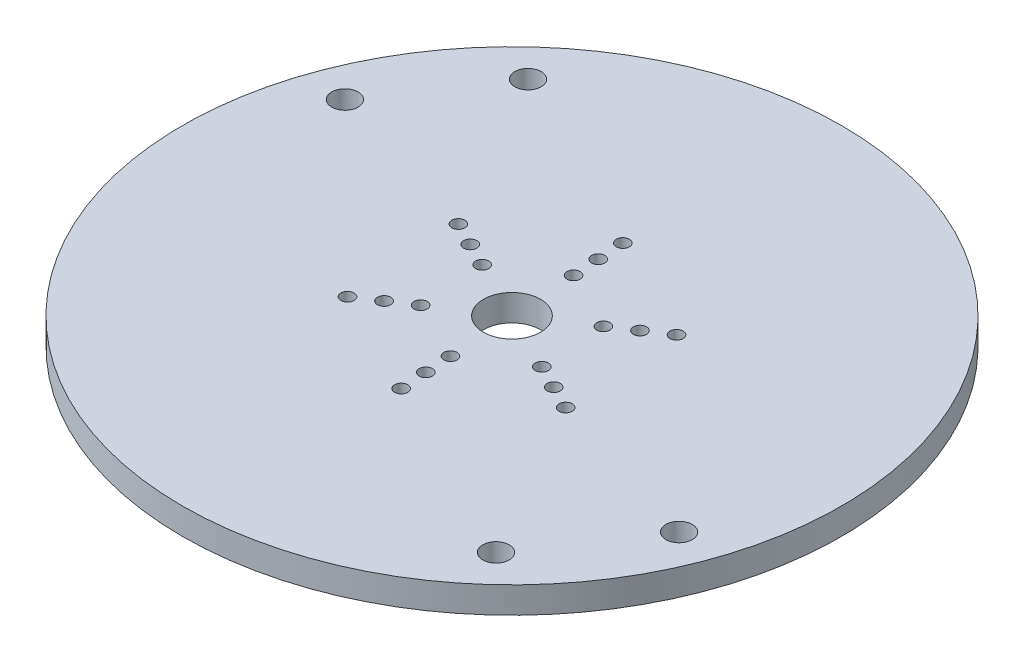
ISO-10303-21;
HEADER;
FILE_DESCRIPTION(('STEP AP214'),'2;1');
FILE_NAME('part.step','',(''),(''),'','','');
FILE_SCHEMA(('AUTOMOTIVE_DESIGN { 1 0 10303 214 1 1 1 1 }'));
ENDSEC;
DATA;
#1=APPLICATION_CONTEXT('core data for automotive mechanical design processes');
#2=APPLICATION_PROTOCOL_DEFINITION('international standard','automotive_design',2000,#1);
#3=PRODUCT_CONTEXT('',#1,'mechanical');
#4=PRODUCT('Part','Part','',(#3));
#5=PRODUCT_RELATED_PRODUCT_CATEGORY('part','',(#4));
#6=PRODUCT_DEFINITION_FORMATION('','',#4);
#7=PRODUCT_DEFINITION_CONTEXT('part definition',#1,'design');
#8=PRODUCT_DEFINITION('design','',#6,#7);
#9=PRODUCT_DEFINITION_SHAPE('','',#8);
#10=(LENGTH_UNIT() NAMED_UNIT(*) SI_UNIT(.MILLI.,.METRE.));
#11=(NAMED_UNIT(*) PLANE_ANGLE_UNIT() SI_UNIT($,.RADIAN.));
#12=(NAMED_UNIT(*) SI_UNIT($,.STERADIAN.) SOLID_ANGLE_UNIT());
#13=UNCERTAINTY_MEASURE_WITH_UNIT(LENGTH_MEASURE(1.E-05),#10,'distance_accuracy_value','');
#14=(GEOMETRIC_REPRESENTATION_CONTEXT(3) GLOBAL_UNCERTAINTY_ASSIGNED_CONTEXT((#13)) GLOBAL_UNIT_ASSIGNED_CONTEXT((#10,
#11,#12)) REPRESENTATION_CONTEXT('',''));
#15=CARTESIAN_POINT('',(0.,0.,0.));
#16=DIRECTION('',(0.,0.,1.));
#17=DIRECTION('',(1.,0.,0.));
#18=AXIS2_PLACEMENT_3D('',#15,#16,#17);
#19=CARTESIAN_POINT('',(0.,3.,0.));
#20=DIRECTION('',(0.,1.,0.));
#21=DIRECTION('',(0.,0.,1.));
#22=AXIS2_PLACEMENT_3D('',#19,#20,#21);
#23=PLANE('',#22);
#24=CARTESIAN_POINT('',(30.8159272313347,3.,11.8058726434488));
#25=DIRECTION('',(0.,1.,0.));
#26=DIRECTION('',(0.,0.,1.));
#27=AXIS2_PLACEMENT_3D('',#24,#25,#26);
#28=CIRCLE('',#27,1.5);
#29=CARTESIAN_POINT('',(30.8159272313347,3.,13.3058726434488));
#30=VERTEX_POINT('',#29);
#31=EDGE_CURVE('E173',#30,#30,#28,.T.);
#32=ORIENTED_EDGE('',*,*,#31,.F.);
#33=EDGE_LOOP('',(#32));
#34=FACE_BOUND('',#33,.T.);
#35=CARTESIAN_POINT('',(-22.4065879809971,3.,-24.2269439890752));
#36=DIRECTION('',(0.,1.,0.));
#37=DIRECTION('',(0.,0.,1.));
#38=AXIS2_PLACEMENT_3D('',#35,#36,#37);
#39=CIRCLE('',#38,1.5);
#40=CARTESIAN_POINT('',(-22.4065879809971,3.,-22.7269439890752));
#41=VERTEX_POINT('',#40);
#42=EDGE_CURVE('E161',#41,#41,#39,.T.);
#43=ORIENTED_EDGE('',*,*,#42,.F.);
#44=EDGE_LOOP('',(#43));
#45=FACE_BOUND('',#44,.T.);
#46=CARTESIAN_POINT('',(0.863160320935388,3.,13.4723774539));
#47=DIRECTION('',(0.,1.,0.));
#48=DIRECTION('',(0.,0.,1.));
#49=AXIS2_PLACEMENT_3D('',#46,#47,#48);
#50=CIRCLE('',#49,0.750000000000854);
#51=CARTESIAN_POINT('',(0.863160320935388,3.,14.2223774539008));
#52=VERTEX_POINT('',#51);
#53=EDGE_CURVE('E149',#52,#52,#50,.T.);
#54=ORIENTED_EDGE('',*,*,#53,.F.);
#55=EDGE_LOOP('',(#54));
#56=FACE_BOUND('',#55,.T.);
#57=CARTESIAN_POINT('',(0.479533511631039,3.,7.48465414105537));
#58=DIRECTION('',(0.,1.,0.));
#59=DIRECTION('',(0.,0.,1.));
#60=AXIS2_PLACEMENT_3D('',#57,#58,#59);
#61=CIRCLE('',#60,0.750000000000796);
#62=CARTESIAN_POINT('',(0.479533511631039,3.,8.23465414105617));
#63=VERTEX_POINT('',#62);
#64=EDGE_CURVE('E137',#63,#63,#61,.T.);
#65=ORIENTED_EDGE('',*,*,#64,.F.);
#66=EDGE_LOOP('',(#65));
#67=FACE_BOUND('',#66,.T.);
#68=CARTESIAN_POINT('',(-8.73898741643086,3.,5.82066138299208));
#69=DIRECTION('',(0.,1.,0.));
#70=DIRECTION('',(0.,0.,1.));
#71=AXIS2_PLACEMENT_3D('',#68,#69,#70);
#72=CIRCLE('',#71,0.750000000000445);
#73=CARTESIAN_POINT('',(-8.73898741643086,3.,6.57066138299253));
#74=VERTEX_POINT('',#73);
#75=EDGE_CURVE('E125',#74,#74,#72,.T.);
#76=ORIENTED_EDGE('',*,*,#75,.F.);
#77=EDGE_LOOP('',(#76));
#78=FACE_BOUND('',#77,.T.);
#79=CARTESIAN_POINT('',(12.0990012849182,3.,5.98866996148121));
#80=DIRECTION('',(0.,1.,0.));
#81=DIRECTION('',(0.,0.,1.));
#82=AXIS2_PLACEMENT_3D('',#79,#80,#81);
#83=CIRCLE('',#82,0.750000000000913);
#84=CARTESIAN_POINT('',(12.0990012849182,3.,6.73866996148212));
#85=VERTEX_POINT('',#84);
#86=EDGE_CURVE('E113',#85,#85,#83,.T.);
#87=ORIENTED_EDGE('',*,*,#86,.F.);
#88=EDGE_LOOP('',(#87));
#89=FACE_BOUND('',#88,.T.);
#90=CARTESIAN_POINT('',(6.72166738051029,3.,3.32703886748922));
#91=DIRECTION('',(0.,1.,0.));
#92=DIRECTION('',(0.,0.,1.));
#93=AXIS2_PLACEMENT_3D('',#90,#91,#92);
#94=CIRCLE('',#93,0.750000000000871);
#95=CARTESIAN_POINT('',(6.72166738051029,3.,4.07703886749009));
#96=VERTEX_POINT('',#95);
#97=EDGE_CURVE('E101',#96,#96,#94,.T.);
#98=ORIENTED_EDGE('',*,*,#97,.F.);
#99=EDGE_LOOP('',(#98));
#100=FACE_BOUND('',#99,.T.);
#101=CARTESIAN_POINT('',(-9.41033433271387,3.,-4.65785441448598));
#102=DIRECTION('',(0.,1.,0.));
#103=DIRECTION('',(0.,0.,1.));
#104=AXIS2_PLACEMENT_3D('',#101,#102,#103);
#105=CIRCLE('',#104,0.750000000000015);
#106=CARTESIAN_POINT('',(-9.41033433271387,3.,-3.90785441448597));
#107=VERTEX_POINT('',#106);
#108=EDGE_CURVE('E89',#107,#107,#105,.T.);
#109=ORIENTED_EDGE('',*,*,#108,.F.);
#110=EDGE_LOOP('',(#109));
#111=FACE_BOUND('',#110,.T.);
#112=CARTESIAN_POINT('',(11.235840963983,3.,-7.48370749241916));
#113=DIRECTION('',(0.,1.,0.));
#114=DIRECTION('',(0.,0.,1.));
#115=AXIS2_PLACEMENT_3D('',#112,#113,#114);
#116=CIRCLE('',#115,0.750000000000572);
#117=CARTESIAN_POINT('',(11.235840963983,3.,-6.73370749241859));
#118=VERTEX_POINT('',#117);
#119=EDGE_CURVE('E77',#118,#118,#116,.T.);
#120=ORIENTED_EDGE('',*,*,#119,.F.);
#121=EDGE_LOOP('',(#120));
#122=FACE_BOUND('',#121,.T.);
#123=CARTESIAN_POINT('',(6.24213386887944,3.,-4.15761527356653));
#124=DIRECTION('',(0.,1.,0.));
#125=DIRECTION('',(0.,0.,1.));
#126=AXIS2_PLACEMENT_3D('',#123,#124,#125);
#127=CIRCLE('',#126,0.750000000000541);
#128=CARTESIAN_POINT('',(6.24213386887944,3.,-3.40761527356599));
#129=VERTEX_POINT('',#128);
#130=EDGE_CURVE('E65',#129,#129,#127,.T.);
#131=ORIENTED_EDGE('',*,*,#130,.F.);
#132=EDGE_LOOP('',(#131));
#133=FACE_BOUND('',#132,.T.);
#134=CARTESIAN_POINT('',(-0.67134691628258,3.,-10.4785157974781));
#135=DIRECTION('',(0.,1.,0.));
#136=DIRECTION('',(0.,0.,1.));
#137=AXIS2_PLACEMENT_3D('',#134,#135,#136);
#138=CIRCLE('',#137,0.750000000000001);
#139=CARTESIAN_POINT('',(-0.67134691628258,3.,-9.7285157974781));
#140=VERTEX_POINT('',#139);
#141=EDGE_CURVE('E53',#140,#140,#138,.T.);
#142=ORIENTED_EDGE('',*,*,#141,.F.);
#143=EDGE_LOOP('',(#142));
#144=FACE_BOUND('',#143,.T.);
#145=CARTESIAN_POINT('',(0.,3.,0.));
#146=DIRECTION('',(0.,1.,0.));
#147=DIRECTION('',(0.,0.,1.));
#148=AXIS2_PLACEMENT_3D('',#145,#146,#147);
#149=CIRCLE('',#148,37.5);
#150=CARTESIAN_POINT('',(0.,3.,37.5));
#151=VERTEX_POINT('',#150);
#152=EDGE_CURVE('E10',#151,#151,#149,.T.);
#153=ORIENTED_EDGE('',*,*,#152,.T.);
#154=EDGE_LOOP('',(#153));
#155=FACE_BOUND('',#154,.T.);
#156=CARTESIAN_POINT('',(-0.863160320934746,3.,-13.4723774539004));
#157=DIRECTION('',(0.,1.,0.));
#158=DIRECTION('',(0.,0.,1.));
#159=AXIS2_PLACEMENT_3D('',#156,#157,#158);
#160=CIRCLE('',#159,0.75);
#161=CARTESIAN_POINT('',(-0.863160320934746,3.,-12.7223774539004));
#162=VERTEX_POINT('',#161);
#163=EDGE_CURVE('E48',#162,#162,#160,.T.);
#164=ORIENTED_EDGE('',*,*,#163,.F.);
#165=EDGE_LOOP('',(#164));
#166=FACE_BOUND('',#165,.T.);
#167=CARTESIAN_POINT('',(-0.479533511630414,3.,-7.48465414105579));
#168=DIRECTION('',(0.,1.,0.));
#169=DIRECTION('',(0.,0.,1.));
#170=AXIS2_PLACEMENT_3D('',#167,#168,#169);
#171=CIRCLE('',#170,0.75);
#172=CARTESIAN_POINT('',(-0.479533511630414,3.,-6.73465414105579));
#173=VERTEX_POINT('',#172);
#174=EDGE_CURVE('E59',#173,#173,#171,.T.);
#175=ORIENTED_EDGE('',*,*,#174,.F.);
#176=EDGE_LOOP('',(#175));
#177=FACE_BOUND('',#176,.T.);
#178=CARTESIAN_POINT('',(8.73898741643124,3.,-5.82066138299285));
#179=DIRECTION('',(0.,1.,0.));
#180=DIRECTION('',(0.,0.,1.));
#181=AXIS2_PLACEMENT_3D('',#178,#179,#180);
#182=CIRCLE('',#181,0.750000000000557);
#183=CARTESIAN_POINT('',(8.73898741643124,3.,-5.07066138299229));
#184=VERTEX_POINT('',#183);
#185=EDGE_CURVE('E71',#184,#184,#182,.T.);
#186=ORIENTED_EDGE('',*,*,#185,.F.);
#187=EDGE_LOOP('',(#186));
#188=FACE_BOUND('',#187,.T.);
#189=CARTESIAN_POINT('',(-12.0990012849178,3.,-5.98866996148198));
#190=DIRECTION('',(0.,1.,0.));
#191=DIRECTION('',(0.,0.,1.));
#192=AXIS2_PLACEMENT_3D('',#189,#190,#191);
#193=CIRCLE('',#192,0.75);
#194=CARTESIAN_POINT('',(-12.0990012849178,3.,-5.23866996148198));
#195=VERTEX_POINT('',#194);
#196=EDGE_CURVE('E83',#195,#195,#193,.T.);
#197=ORIENTED_EDGE('',*,*,#196,.F.);
#198=EDGE_LOOP('',(#197));
#199=FACE_BOUND('',#198,.T.);
#200=CARTESIAN_POINT('',(-6.72166738050991,3.,-3.32703886748999));
#201=DIRECTION('',(0.,1.,0.));
#202=DIRECTION('',(0.,0.,1.));
#203=AXIS2_PLACEMENT_3D('',#200,#201,#202);
#204=CIRCLE('',#203,0.75);
#205=CARTESIAN_POINT('',(-6.72166738050991,3.,-2.57703886748999));
#206=VERTEX_POINT('',#205);
#207=EDGE_CURVE('E95',#206,#206,#204,.T.);
#208=ORIENTED_EDGE('',*,*,#207,.F.);
#209=EDGE_LOOP('',(#208));
#210=FACE_BOUND('',#209,.T.);
#211=CARTESIAN_POINT('',(9.41033433271426,3.,4.65785441448521));
#212=DIRECTION('',(0.,1.,0.));
#213=DIRECTION('',(0.,0.,1.));
#214=AXIS2_PLACEMENT_3D('',#211,#212,#213);
#215=CIRCLE('',#214,0.750000000000891);
#216=CARTESIAN_POINT('',(9.41033433271426,3.,5.4078544144861));
#217=VERTEX_POINT('',#216);
#218=EDGE_CURVE('E107',#217,#217,#215,.T.);
#219=ORIENTED_EDGE('',*,*,#218,.F.);
#220=EDGE_LOOP('',(#219));
#221=FACE_BOUND('',#220,.T.);
#222=CARTESIAN_POINT('',(-11.2358409639826,3.,7.48370749241839));
#223=DIRECTION('',(0.,1.,0.));
#224=DIRECTION('',(0.,0.,1.));
#225=AXIS2_PLACEMENT_3D('',#222,#223,#224);
#226=CIRCLE('',#225,0.750000000000477);
#227=CARTESIAN_POINT('',(-11.2358409639826,3.,8.23370749241887));
#228=VERTEX_POINT('',#227);
#229=EDGE_CURVE('E119',#228,#228,#226,.T.);
#230=ORIENTED_EDGE('',*,*,#229,.F.);
#231=EDGE_LOOP('',(#230));
#232=FACE_BOUND('',#231,.T.);
#233=CARTESIAN_POINT('',(-6.24213386887954,3.,4.15761527356571));
#234=DIRECTION('',(0.,1.,0.));
#235=DIRECTION('',(0.,0.,1.));
#236=AXIS2_PLACEMENT_3D('',#233,#234,#235);
#237=CIRCLE('',#236,0.749999999999999);
#238=CARTESIAN_POINT('',(-6.24213386887954,3.,4.90761527356571));
#239=VERTEX_POINT('',#238);
#240=EDGE_CURVE('E131',#239,#239,#237,.T.);
#241=ORIENTED_EDGE('',*,*,#240,.F.);
#242=EDGE_LOOP('',(#241));
#243=FACE_BOUND('',#242,.T.);
#244=CARTESIAN_POINT('',(0.671346916283204,3.,10.4785157974777));
#245=DIRECTION('',(0.,1.,0.));
#246=DIRECTION('',(0.,0.,1.));
#247=AXIS2_PLACEMENT_3D('',#244,#245,#246);
#248=CIRCLE('',#247,0.750000000000822);
#249=CARTESIAN_POINT('',(0.671346916283204,3.,11.2285157974785));
#250=VERTEX_POINT('',#249);
#251=EDGE_CURVE('E143',#250,#250,#248,.T.);
#252=ORIENTED_EDGE('',*,*,#251,.F.);
#253=EDGE_LOOP('',(#252));
#254=FACE_BOUND('',#253,.T.);
#255=CARTESIAN_POINT('',(0.,3.,0.));
#256=DIRECTION('',(0.,1.,0.));
#257=DIRECTION('',(0.,0.,1.));
#258=AXIS2_PLACEMENT_3D('',#255,#256,#257);
#259=CIRCLE('',#258,3.25);
#260=CARTESIAN_POINT('',(0.,3.,3.25));
#261=VERTEX_POINT('',#260);
#262=EDGE_CURVE('E155',#261,#261,#259,.T.);
#263=ORIENTED_EDGE('',*,*,#262,.F.);
#264=EDGE_LOOP('',(#263));
#265=FACE_BOUND('',#264,.T.);
#266=CARTESIAN_POINT('',(-30.8159272313233,3.,-11.8058726434576));
#267=DIRECTION('',(0.,1.,0.));
#268=DIRECTION('',(0.,0.,1.));
#269=AXIS2_PLACEMENT_3D('',#266,#267,#268);
#270=CIRCLE('',#269,1.5);
#271=CARTESIAN_POINT('',(-30.8159272313233,3.,-10.3058726434576));
#272=VERTEX_POINT('',#271);
#273=EDGE_CURVE('E167',#272,#272,#270,.T.);
#274=ORIENTED_EDGE('',*,*,#273,.F.);
#275=EDGE_LOOP('',(#274));
#276=FACE_BOUND('',#275,.T.);
#277=CARTESIAN_POINT('',(22.4065879810086,3.,24.2269439890665));
#278=DIRECTION('',(0.,1.,0.));
#279=DIRECTION('',(0.,0.,1.));
#280=AXIS2_PLACEMENT_3D('',#277,#278,#279);
#281=CIRCLE('',#280,1.5);
#282=CARTESIAN_POINT('',(22.4065879810086,3.,25.7269439890665));
#283=VERTEX_POINT('',#282);
#284=EDGE_CURVE('E179',#283,#283,#281,.T.);
#285=ORIENTED_EDGE('',*,*,#284,.F.);
#286=EDGE_LOOP('',(#285));
#287=FACE_BOUND('',#286,.T.);
#288=ADVANCED_FACE('F37',(#34,#45,#56,#67,#78,#89,#100,#111,#122,#133,#144,#155,#166,#177,#188,
#199,#210,#221,#232,#243,#254,#265,#276,#287),#23,.T.);
#289=CARTESIAN_POINT('',(0.,0.,0.));
#290=DIRECTION('',(0.,1.,0.));
#291=DIRECTION('',(0.,0.,1.));
#292=AXIS2_PLACEMENT_3D('',#289,#290,#291);
#293=PLANE('',#292);
#294=CARTESIAN_POINT('',(0.,0.,0.));
#295=DIRECTION('',(0.,1.,0.));
#296=DIRECTION('',(0.,0.,1.));
#297=AXIS2_PLACEMENT_3D('',#294,#295,#296);
#298=CIRCLE('',#297,37.5);
#299=CARTESIAN_POINT('',(0.,0.,37.5));
#300=VERTEX_POINT('',#299);
#301=EDGE_CURVE('E41',#300,#300,#298,.T.);
#302=ORIENTED_EDGE('',*,*,#301,.F.);
#303=EDGE_LOOP('',(#302));
#304=FACE_BOUND('',#303,.T.);
#305=CARTESIAN_POINT('',(-0.863160320934746,0.,-13.4723774539004));
#306=DIRECTION('',(0.,1.,0.));
#307=DIRECTION('',(0.,0.,1.));
#308=AXIS2_PLACEMENT_3D('',#305,#306,#307);
#309=CIRCLE('',#308,0.75);
#310=CARTESIAN_POINT('',(-0.863160320934746,0.,-12.7223774539004));
#311=VERTEX_POINT('',#310);
#312=EDGE_CURVE('E50',#311,#311,#309,.T.);
#313=ORIENTED_EDGE('',*,*,#312,.T.);
#314=EDGE_LOOP('',(#313));
#315=FACE_BOUND('',#314,.T.);
#316=CARTESIAN_POINT('',(-0.67134691628258,0.,-10.4785157974781));
#317=DIRECTION('',(0.,1.,0.));
#318=DIRECTION('',(0.,0.,1.));
#319=AXIS2_PLACEMENT_3D('',#316,#317,#318);
#320=CIRCLE('',#319,0.750000000000001);
#321=CARTESIAN_POINT('',(-0.67134691628258,0.,-9.7285157974781));
#322=VERTEX_POINT('',#321);
#323=EDGE_CURVE('E56',#322,#322,#320,.T.);
#324=ORIENTED_EDGE('',*,*,#323,.T.);
#325=EDGE_LOOP('',(#324));
#326=FACE_BOUND('',#325,.T.);
#327=CARTESIAN_POINT('',(-0.479533511630414,0.,-7.48465414105579));
#328=DIRECTION('',(0.,1.,0.));
#329=DIRECTION('',(0.,0.,1.));
#330=AXIS2_PLACEMENT_3D('',#327,#328,#329);
#331=CIRCLE('',#330,0.75);
#332=CARTESIAN_POINT('',(-0.479533511630414,0.,-6.73465414105579));
#333=VERTEX_POINT('',#332);
#334=EDGE_CURVE('E62',#333,#333,#331,.T.);
#335=ORIENTED_EDGE('',*,*,#334,.T.);
#336=EDGE_LOOP('',(#335));
#337=FACE_BOUND('',#336,.T.);
#338=CARTESIAN_POINT('',(6.24213386887944,0.,-4.15761527356653));
#339=DIRECTION('',(0.,1.,0.));
#340=DIRECTION('',(0.,0.,1.));
#341=AXIS2_PLACEMENT_3D('',#338,#339,#340);
#342=CIRCLE('',#341,0.750000000000541);
#343=CARTESIAN_POINT('',(6.24213386887944,0.,-3.40761527356599));
#344=VERTEX_POINT('',#343);
#345=EDGE_CURVE('E68',#344,#344,#342,.T.);
#346=ORIENTED_EDGE('',*,*,#345,.T.);
#347=EDGE_LOOP('',(#346));
#348=FACE_BOUND('',#347,.T.);
#349=CARTESIAN_POINT('',(8.73898741643124,0.,-5.82066138299285));
#350=DIRECTION('',(0.,1.,0.));
#351=DIRECTION('',(0.,0.,1.));
#352=AXIS2_PLACEMENT_3D('',#349,#350,#351);
#353=CIRCLE('',#352,0.750000000000557);
#354=CARTESIAN_POINT('',(8.73898741643124,0.,-5.07066138299229));
#355=VERTEX_POINT('',#354);
#356=EDGE_CURVE('E74',#355,#355,#353,.T.);
#357=ORIENTED_EDGE('',*,*,#356,.T.);
#358=EDGE_LOOP('',(#357));
#359=FACE_BOUND('',#358,.T.);
#360=CARTESIAN_POINT('',(11.235840963983,0.,-7.48370749241916));
#361=DIRECTION('',(0.,1.,0.));
#362=DIRECTION('',(0.,0.,1.));
#363=AXIS2_PLACEMENT_3D('',#360,#361,#362);
#364=CIRCLE('',#363,0.750000000000572);
#365=CARTESIAN_POINT('',(11.235840963983,0.,-6.73370749241859));
#366=VERTEX_POINT('',#365);
#367=EDGE_CURVE('E80',#366,#366,#364,.T.);
#368=ORIENTED_EDGE('',*,*,#367,.T.);
#369=EDGE_LOOP('',(#368));
#370=FACE_BOUND('',#369,.T.);
#371=CARTESIAN_POINT('',(-12.0990012849178,0.,-5.98866996148198));
#372=DIRECTION('',(0.,1.,0.));
#373=DIRECTION('',(0.,0.,1.));
#374=AXIS2_PLACEMENT_3D('',#371,#372,#373);
#375=CIRCLE('',#374,0.75);
#376=CARTESIAN_POINT('',(-12.0990012849178,0.,-5.23866996148198));
#377=VERTEX_POINT('',#376);
#378=EDGE_CURVE('E86',#377,#377,#375,.T.);
#379=ORIENTED_EDGE('',*,*,#378,.T.);
#380=EDGE_LOOP('',(#379));
#381=FACE_BOUND('',#380,.T.);
#382=CARTESIAN_POINT('',(-9.41033433271387,0.,-4.65785441448598));
#383=DIRECTION('',(0.,1.,0.));
#384=DIRECTION('',(0.,0.,1.));
#385=AXIS2_PLACEMENT_3D('',#382,#383,#384);
#386=CIRCLE('',#385,0.750000000000015);
#387=CARTESIAN_POINT('',(-9.41033433271387,0.,-3.90785441448597));
#388=VERTEX_POINT('',#387);
#389=EDGE_CURVE('E92',#388,#388,#386,.T.);
#390=ORIENTED_EDGE('',*,*,#389,.T.);
#391=EDGE_LOOP('',(#390));
#392=FACE_BOUND('',#391,.T.);
#393=CARTESIAN_POINT('',(-6.72166738050991,0.,-3.32703886748999));
#394=DIRECTION('',(0.,1.,0.));
#395=DIRECTION('',(0.,0.,1.));
#396=AXIS2_PLACEMENT_3D('',#393,#394,#395);
#397=CIRCLE('',#396,0.75);
#398=CARTESIAN_POINT('',(-6.72166738050991,0.,-2.57703886748999));
#399=VERTEX_POINT('',#398);
#400=EDGE_CURVE('E98',#399,#399,#397,.T.);
#401=ORIENTED_EDGE('',*,*,#400,.T.);
#402=EDGE_LOOP('',(#401));
#403=FACE_BOUND('',#402,.T.);
#404=CARTESIAN_POINT('',(6.72166738051029,0.,3.32703886748922));
#405=DIRECTION('',(0.,1.,0.));
#406=DIRECTION('',(0.,0.,1.));
#407=AXIS2_PLACEMENT_3D('',#404,#405,#406);
#408=CIRCLE('',#407,0.750000000000871);
#409=CARTESIAN_POINT('',(6.72166738051029,0.,4.07703886749009));
#410=VERTEX_POINT('',#409);
#411=EDGE_CURVE('E104',#410,#410,#408,.T.);
#412=ORIENTED_EDGE('',*,*,#411,.T.);
#413=EDGE_LOOP('',(#412));
#414=FACE_BOUND('',#413,.T.);
#415=CARTESIAN_POINT('',(9.41033433271426,0.,4.65785441448521));
#416=DIRECTION('',(0.,1.,0.));
#417=DIRECTION('',(0.,0.,1.));
#418=AXIS2_PLACEMENT_3D('',#415,#416,#417);
#419=CIRCLE('',#418,0.750000000000891);
#420=CARTESIAN_POINT('',(9.41033433271426,0.,5.4078544144861));
#421=VERTEX_POINT('',#420);
#422=EDGE_CURVE('E110',#421,#421,#419,.T.);
#423=ORIENTED_EDGE('',*,*,#422,.T.);
#424=EDGE_LOOP('',(#423));
#425=FACE_BOUND('',#424,.T.);
#426=CARTESIAN_POINT('',(12.0990012849182,0.,5.98866996148121));
#427=DIRECTION('',(0.,1.,0.));
#428=DIRECTION('',(0.,0.,1.));
#429=AXIS2_PLACEMENT_3D('',#426,#427,#428);
#430=CIRCLE('',#429,0.750000000000913);
#431=CARTESIAN_POINT('',(12.0990012849182,0.,6.73866996148212));
#432=VERTEX_POINT('',#431);
#433=EDGE_CURVE('E116',#432,#432,#430,.T.);
#434=ORIENTED_EDGE('',*,*,#433,.T.);
#435=EDGE_LOOP('',(#434));
#436=FACE_BOUND('',#435,.T.);
#437=CARTESIAN_POINT('',(-11.2358409639826,0.,7.48370749241839));
#438=DIRECTION('',(0.,1.,0.));
#439=DIRECTION('',(0.,0.,1.));
#440=AXIS2_PLACEMENT_3D('',#437,#438,#439);
#441=CIRCLE('',#440,0.750000000000477);
#442=CARTESIAN_POINT('',(-11.2358409639826,0.,8.23370749241887));
#443=VERTEX_POINT('',#442);
#444=EDGE_CURVE('E122',#443,#443,#441,.T.);
#445=ORIENTED_EDGE('',*,*,#444,.T.);
#446=EDGE_LOOP('',(#445));
#447=FACE_BOUND('',#446,.T.);
#448=CARTESIAN_POINT('',(-8.73898741643086,0.,5.82066138299208));
#449=DIRECTION('',(0.,1.,0.));
#450=DIRECTION('',(0.,0.,1.));
#451=AXIS2_PLACEMENT_3D('',#448,#449,#450);
#452=CIRCLE('',#451,0.750000000000445);
#453=CARTESIAN_POINT('',(-8.73898741643086,0.,6.57066138299253));
#454=VERTEX_POINT('',#453);
#455=EDGE_CURVE('E128',#454,#454,#452,.T.);
#456=ORIENTED_EDGE('',*,*,#455,.T.);
#457=EDGE_LOOP('',(#456));
#458=FACE_BOUND('',#457,.T.);
#459=CARTESIAN_POINT('',(-6.24213386887954,0.,4.15761527356571));
#460=DIRECTION('',(0.,1.,0.));
#461=DIRECTION('',(0.,0.,1.));
#462=AXIS2_PLACEMENT_3D('',#459,#460,#461);
#463=CIRCLE('',#462,0.749999999999999);
#464=CARTESIAN_POINT('',(-6.24213386887954,0.,4.90761527356571));
#465=VERTEX_POINT('',#464);
#466=EDGE_CURVE('E134',#465,#465,#463,.T.);
#467=ORIENTED_EDGE('',*,*,#466,.T.);
#468=EDGE_LOOP('',(#467));
#469=FACE_BOUND('',#468,.T.);
#470=CARTESIAN_POINT('',(0.479533511631039,0.,7.48465414105537));
#471=DIRECTION('',(0.,1.,0.));
#472=DIRECTION('',(0.,0.,1.));
#473=AXIS2_PLACEMENT_3D('',#470,#471,#472);
#474=CIRCLE('',#473,0.750000000000796);
#475=CARTESIAN_POINT('',(0.479533511631039,0.,8.23465414105617));
#476=VERTEX_POINT('',#475);
#477=EDGE_CURVE('E140',#476,#476,#474,.T.);
#478=ORIENTED_EDGE('',*,*,#477,.T.);
#479=EDGE_LOOP('',(#478));
#480=FACE_BOUND('',#479,.T.);
#481=CARTESIAN_POINT('',(0.671346916283204,0.,10.4785157974777));
#482=DIRECTION('',(0.,1.,0.));
#483=DIRECTION('',(0.,0.,1.));
#484=AXIS2_PLACEMENT_3D('',#481,#482,#483);
#485=CIRCLE('',#484,0.750000000000822);
#486=CARTESIAN_POINT('',(0.671346916283204,0.,11.2285157974785));
#487=VERTEX_POINT('',#486);
#488=EDGE_CURVE('E146',#487,#487,#485,.T.);
#489=ORIENTED_EDGE('',*,*,#488,.T.);
#490=EDGE_LOOP('',(#489));
#491=FACE_BOUND('',#490,.T.);
#492=CARTESIAN_POINT('',(0.863160320935388,0.,13.4723774539));
#493=DIRECTION('',(0.,1.,0.));
#494=DIRECTION('',(0.,0.,1.));
#495=AXIS2_PLACEMENT_3D('',#492,#493,#494);
#496=CIRCLE('',#495,0.750000000000854);
#497=CARTESIAN_POINT('',(0.863160320935388,0.,14.2223774539008));
#498=VERTEX_POINT('',#497);
#499=EDGE_CURVE('E152',#498,#498,#496,.T.);
#500=ORIENTED_EDGE('',*,*,#499,.T.);
#501=EDGE_LOOP('',(#500));
#502=FACE_BOUND('',#501,.T.);
#503=CARTESIAN_POINT('',(0.,0.,0.));
#504=DIRECTION('',(0.,1.,0.));
#505=DIRECTION('',(0.,0.,1.));
#506=AXIS2_PLACEMENT_3D('',#503,#504,#505);
#507=CIRCLE('',#506,3.25);
#508=CARTESIAN_POINT('',(0.,0.,3.25));
#509=VERTEX_POINT('',#508);
#510=EDGE_CURVE('E158',#509,#509,#507,.T.);
#511=ORIENTED_EDGE('',*,*,#510,.T.);
#512=EDGE_LOOP('',(#511));
#513=FACE_BOUND('',#512,.T.);
#514=CARTESIAN_POINT('',(-22.4065879809971,0.,-24.2269439890752));
#515=DIRECTION('',(0.,1.,0.));
#516=DIRECTION('',(0.,0.,1.));
#517=AXIS2_PLACEMENT_3D('',#514,#515,#516);
#518=CIRCLE('',#517,1.5);
#519=CARTESIAN_POINT('',(-22.4065879809971,0.,-22.7269439890752));
#520=VERTEX_POINT('',#519);
#521=EDGE_CURVE('E164',#520,#520,#518,.T.);
#522=ORIENTED_EDGE('',*,*,#521,.T.);
#523=EDGE_LOOP('',(#522));
#524=FACE_BOUND('',#523,.T.);
#525=CARTESIAN_POINT('',(-30.8159272313233,0.,-11.8058726434576));
#526=DIRECTION('',(0.,1.,0.));
#527=DIRECTION('',(0.,0.,1.));
#528=AXIS2_PLACEMENT_3D('',#525,#526,#527);
#529=CIRCLE('',#528,1.5);
#530=CARTESIAN_POINT('',(-30.8159272313233,0.,-10.3058726434576));
#531=VERTEX_POINT('',#530);
#532=EDGE_CURVE('E170',#531,#531,#529,.T.);
#533=ORIENTED_EDGE('',*,*,#532,.T.);
#534=EDGE_LOOP('',(#533));
#535=FACE_BOUND('',#534,.T.);
#536=CARTESIAN_POINT('',(30.8159272313347,0.,11.8058726434488));
#537=DIRECTION('',(0.,1.,0.));
#538=DIRECTION('',(0.,0.,1.));
#539=AXIS2_PLACEMENT_3D('',#536,#537,#538);
#540=CIRCLE('',#539,1.5);
#541=CARTESIAN_POINT('',(30.8159272313347,0.,13.3058726434488));
#542=VERTEX_POINT('',#541);
#543=EDGE_CURVE('E176',#542,#542,#540,.T.);
#544=ORIENTED_EDGE('',*,*,#543,.T.);
#545=EDGE_LOOP('',(#544));
#546=FACE_BOUND('',#545,.T.);
#547=CARTESIAN_POINT('',(22.4065879810086,0.,24.2269439890665));
#548=DIRECTION('',(0.,1.,0.));
#549=DIRECTION('',(0.,0.,1.));
#550=AXIS2_PLACEMENT_3D('',#547,#548,#549);
#551=CIRCLE('',#550,1.5);
#552=CARTESIAN_POINT('',(22.4065879810086,0.,25.7269439890665));
#553=VERTEX_POINT('',#552);
#554=EDGE_CURVE('E182',#553,#553,#551,.T.);
#555=ORIENTED_EDGE('',*,*,#554,.T.);
#556=EDGE_LOOP('',(#555));
#557=FACE_BOUND('',#556,.T.);
#558=ADVANCED_FACE('F192',(#304,#315,#326,#337,#348,#359,#370,#381,#392,#403,#414,#425,#436,
#447,#458,#469,#480,#491,#502,#513,#524,#535,#546,#557),#293,.F.);
#559=CARTESIAN_POINT('',(0.,3.,0.));
#560=DIRECTION('',(0.,-1.,0.));
#561=DIRECTION('',(0.,0.,-1.));
#562=AXIS2_PLACEMENT_3D('',#559,#560,#561);
#563=CYLINDRICAL_SURFACE('',#562,37.5);
#564=ORIENTED_EDGE('',*,*,#152,.F.);
#565=EDGE_LOOP('',(#564));
#566=FACE_BOUND('',#565,.T.);
#567=ORIENTED_EDGE('',*,*,#301,.T.);
#568=EDGE_LOOP('',(#567));
#569=FACE_BOUND('',#568,.T.);
#570=ADVANCED_FACE('F39',(#566,#569),#563,.T.);
#571=CARTESIAN_POINT('',(-0.863160320934746,3.,-13.4723774539004));
#572=DIRECTION('',(0.,-1.,0.));
#573=DIRECTION('',(0.,0.,-1.));
#574=AXIS2_PLACEMENT_3D('',#571,#572,#573);
#575=CYLINDRICAL_SURFACE('',#574,0.75);
#576=ORIENTED_EDGE('',*,*,#163,.T.);
#577=EDGE_LOOP('',(#576));
#578=FACE_BOUND('',#577,.T.);
#579=ORIENTED_EDGE('',*,*,#312,.F.);
#580=EDGE_LOOP('',(#579));
#581=FACE_BOUND('',#580,.T.);
#582=ADVANCED_FACE('F202',(#578,#581),#575,.F.);
#583=CARTESIAN_POINT('',(-0.67134691628258,3.,-10.4785157974781));
#584=DIRECTION('',(0.,-1.,0.));
#585=DIRECTION('',(0.,0.,-1.));
#586=AXIS2_PLACEMENT_3D('',#583,#584,#585);
#587=CYLINDRICAL_SURFACE('',#586,0.750000000000001);
#588=ORIENTED_EDGE('',*,*,#141,.T.);
#589=EDGE_LOOP('',(#588));
#590=FACE_BOUND('',#589,.T.);
#591=ORIENTED_EDGE('',*,*,#323,.F.);
#592=EDGE_LOOP('',(#591));
#593=FACE_BOUND('',#592,.T.);
#594=ADVANCED_FACE('F205',(#590,#593),#587,.F.);
#595=CARTESIAN_POINT('',(-0.479533511630414,3.,-7.48465414105579));
#596=DIRECTION('',(0.,-1.,0.));
#597=DIRECTION('',(0.,0.,-1.));
#598=AXIS2_PLACEMENT_3D('',#595,#596,#597);
#599=CYLINDRICAL_SURFACE('',#598,0.75);
#600=ORIENTED_EDGE('',*,*,#174,.T.);
#601=EDGE_LOOP('',(#600));
#602=FACE_BOUND('',#601,.T.);
#603=ORIENTED_EDGE('',*,*,#334,.F.);
#604=EDGE_LOOP('',(#603));
#605=FACE_BOUND('',#604,.T.);
#606=ADVANCED_FACE('F209',(#602,#605),#599,.F.);
#607=CARTESIAN_POINT('',(6.24213386887944,3.,-4.15761527356653));
#608=DIRECTION('',(0.,-1.,0.));
#609=DIRECTION('',(0.,0.,-1.));
#610=AXIS2_PLACEMENT_3D('',#607,#608,#609);
#611=CYLINDRICAL_SURFACE('',#610,0.750000000000541);
#612=ORIENTED_EDGE('',*,*,#130,.T.);
#613=EDGE_LOOP('',(#612));
#614=FACE_BOUND('',#613,.T.);
#615=ORIENTED_EDGE('',*,*,#345,.F.);
#616=EDGE_LOOP('',(#615));
#617=FACE_BOUND('',#616,.T.);
#618=ADVANCED_FACE('F213',(#614,#617),#611,.F.);
#619=CARTESIAN_POINT('',(8.73898741643124,3.,-5.82066138299285));
#620=DIRECTION('',(0.,-1.,0.));
#621=DIRECTION('',(0.,0.,-1.));
#622=AXIS2_PLACEMENT_3D('',#619,#620,#621);
#623=CYLINDRICAL_SURFACE('',#622,0.750000000000557);
#624=ORIENTED_EDGE('',*,*,#185,.T.);
#625=EDGE_LOOP('',(#624));
#626=FACE_BOUND('',#625,.T.);
#627=ORIENTED_EDGE('',*,*,#356,.F.);
#628=EDGE_LOOP('',(#627));
#629=FACE_BOUND('',#628,.T.);
#630=ADVANCED_FACE('F217',(#626,#629),#623,.F.);
#631=CARTESIAN_POINT('',(11.235840963983,3.,-7.48370749241916));
#632=DIRECTION('',(0.,-1.,0.));
#633=DIRECTION('',(0.,0.,-1.));
#634=AXIS2_PLACEMENT_3D('',#631,#632,#633);
#635=CYLINDRICAL_SURFACE('',#634,0.750000000000572);
#636=ORIENTED_EDGE('',*,*,#119,.T.);
#637=EDGE_LOOP('',(#636));
#638=FACE_BOUND('',#637,.T.);
#639=ORIENTED_EDGE('',*,*,#367,.F.);
#640=EDGE_LOOP('',(#639));
#641=FACE_BOUND('',#640,.T.);
#642=ADVANCED_FACE('F221',(#638,#641),#635,.F.);
#643=CARTESIAN_POINT('',(-12.0990012849178,3.,-5.98866996148198));
#644=DIRECTION('',(0.,-1.,0.));
#645=DIRECTION('',(0.,0.,-1.));
#646=AXIS2_PLACEMENT_3D('',#643,#644,#645);
#647=CYLINDRICAL_SURFACE('',#646,0.75);
#648=ORIENTED_EDGE('',*,*,#196,.T.);
#649=EDGE_LOOP('',(#648));
#650=FACE_BOUND('',#649,.T.);
#651=ORIENTED_EDGE('',*,*,#378,.F.);
#652=EDGE_LOOP('',(#651));
#653=FACE_BOUND('',#652,.T.);
#654=ADVANCED_FACE('F225',(#650,#653),#647,.F.);
#655=CARTESIAN_POINT('',(-9.41033433271387,3.,-4.65785441448598));
#656=DIRECTION('',(0.,-1.,0.));
#657=DIRECTION('',(0.,0.,-1.));
#658=AXIS2_PLACEMENT_3D('',#655,#656,#657);
#659=CYLINDRICAL_SURFACE('',#658,0.750000000000015);
#660=ORIENTED_EDGE('',*,*,#108,.T.);
#661=EDGE_LOOP('',(#660));
#662=FACE_BOUND('',#661,.T.);
#663=ORIENTED_EDGE('',*,*,#389,.F.);
#664=EDGE_LOOP('',(#663));
#665=FACE_BOUND('',#664,.T.);
#666=ADVANCED_FACE('F229',(#662,#665),#659,.F.);
#667=CARTESIAN_POINT('',(-6.72166738050991,3.,-3.32703886748999));
#668=DIRECTION('',(0.,-1.,0.));
#669=DIRECTION('',(0.,0.,-1.));
#670=AXIS2_PLACEMENT_3D('',#667,#668,#669);
#671=CYLINDRICAL_SURFACE('',#670,0.75);
#672=ORIENTED_EDGE('',*,*,#207,.T.);
#673=EDGE_LOOP('',(#672));
#674=FACE_BOUND('',#673,.T.);
#675=ORIENTED_EDGE('',*,*,#400,.F.);
#676=EDGE_LOOP('',(#675));
#677=FACE_BOUND('',#676,.T.);
#678=ADVANCED_FACE('F233',(#674,#677),#671,.F.);
#679=CARTESIAN_POINT('',(6.72166738051029,3.,3.32703886748922));
#680=DIRECTION('',(0.,-1.,0.));
#681=DIRECTION('',(0.,0.,-1.));
#682=AXIS2_PLACEMENT_3D('',#679,#680,#681);
#683=CYLINDRICAL_SURFACE('',#682,0.750000000000871);
#684=ORIENTED_EDGE('',*,*,#97,.T.);
#685=EDGE_LOOP('',(#684));
#686=FACE_BOUND('',#685,.T.);
#687=ORIENTED_EDGE('',*,*,#411,.F.);
#688=EDGE_LOOP('',(#687));
#689=FACE_BOUND('',#688,.T.);
#690=ADVANCED_FACE('F237',(#686,#689),#683,.F.);
#691=CARTESIAN_POINT('',(9.41033433271426,3.,4.65785441448521));
#692=DIRECTION('',(0.,-1.,0.));
#693=DIRECTION('',(0.,0.,-1.));
#694=AXIS2_PLACEMENT_3D('',#691,#692,#693);
#695=CYLINDRICAL_SURFACE('',#694,0.750000000000891);
#696=ORIENTED_EDGE('',*,*,#218,.T.);
#697=EDGE_LOOP('',(#696));
#698=FACE_BOUND('',#697,.T.);
#699=ORIENTED_EDGE('',*,*,#422,.F.);
#700=EDGE_LOOP('',(#699));
#701=FACE_BOUND('',#700,.T.);
#702=ADVANCED_FACE('F241',(#698,#701),#695,.F.);
#703=CARTESIAN_POINT('',(12.0990012849182,3.,5.98866996148121));
#704=DIRECTION('',(0.,-1.,0.));
#705=DIRECTION('',(0.,0.,-1.));
#706=AXIS2_PLACEMENT_3D('',#703,#704,#705);
#707=CYLINDRICAL_SURFACE('',#706,0.750000000000913);
#708=ORIENTED_EDGE('',*,*,#86,.T.);
#709=EDGE_LOOP('',(#708));
#710=FACE_BOUND('',#709,.T.);
#711=ORIENTED_EDGE('',*,*,#433,.F.);
#712=EDGE_LOOP('',(#711));
#713=FACE_BOUND('',#712,.T.);
#714=ADVANCED_FACE('F245',(#710,#713),#707,.F.);
#715=CARTESIAN_POINT('',(-11.2358409639826,3.,7.48370749241839));
#716=DIRECTION('',(0.,-1.,0.));
#717=DIRECTION('',(0.,0.,-1.));
#718=AXIS2_PLACEMENT_3D('',#715,#716,#717);
#719=CYLINDRICAL_SURFACE('',#718,0.750000000000477);
#720=ORIENTED_EDGE('',*,*,#229,.T.);
#721=EDGE_LOOP('',(#720));
#722=FACE_BOUND('',#721,.T.);
#723=ORIENTED_EDGE('',*,*,#444,.F.);
#724=EDGE_LOOP('',(#723));
#725=FACE_BOUND('',#724,.T.);
#726=ADVANCED_FACE('F249',(#722,#725),#719,.F.);
#727=CARTESIAN_POINT('',(-8.73898741643086,3.,5.82066138299208));
#728=DIRECTION('',(0.,-1.,0.));
#729=DIRECTION('',(0.,0.,-1.));
#730=AXIS2_PLACEMENT_3D('',#727,#728,#729);
#731=CYLINDRICAL_SURFACE('',#730,0.750000000000445);
#732=ORIENTED_EDGE('',*,*,#75,.T.);
#733=EDGE_LOOP('',(#732));
#734=FACE_BOUND('',#733,.T.);
#735=ORIENTED_EDGE('',*,*,#455,.F.);
#736=EDGE_LOOP('',(#735));
#737=FACE_BOUND('',#736,.T.);
#738=ADVANCED_FACE('F253',(#734,#737),#731,.F.);
#739=CARTESIAN_POINT('',(-6.24213386887954,3.,4.15761527356571));
#740=DIRECTION('',(0.,-1.,0.));
#741=DIRECTION('',(0.,0.,-1.));
#742=AXIS2_PLACEMENT_3D('',#739,#740,#741);
#743=CYLINDRICAL_SURFACE('',#742,0.749999999999999);
#744=ORIENTED_EDGE('',*,*,#240,.T.);
#745=EDGE_LOOP('',(#744));
#746=FACE_BOUND('',#745,.T.);
#747=ORIENTED_EDGE('',*,*,#466,.F.);
#748=EDGE_LOOP('',(#747));
#749=FACE_BOUND('',#748,.T.);
#750=ADVANCED_FACE('F257',(#746,#749),#743,.F.);
#751=CARTESIAN_POINT('',(0.479533511631039,3.,7.48465414105537));
#752=DIRECTION('',(0.,-1.,0.));
#753=DIRECTION('',(0.,0.,-1.));
#754=AXIS2_PLACEMENT_3D('',#751,#752,#753);
#755=CYLINDRICAL_SURFACE('',#754,0.750000000000796);
#756=ORIENTED_EDGE('',*,*,#64,.T.);
#757=EDGE_LOOP('',(#756));
#758=FACE_BOUND('',#757,.T.);
#759=ORIENTED_EDGE('',*,*,#477,.F.);
#760=EDGE_LOOP('',(#759));
#761=FACE_BOUND('',#760,.T.);
#762=ADVANCED_FACE('F261',(#758,#761),#755,.F.);
#763=CARTESIAN_POINT('',(0.671346916283204,3.,10.4785157974777));
#764=DIRECTION('',(0.,-1.,0.));
#765=DIRECTION('',(0.,0.,-1.));
#766=AXIS2_PLACEMENT_3D('',#763,#764,#765);
#767=CYLINDRICAL_SURFACE('',#766,0.750000000000822);
#768=ORIENTED_EDGE('',*,*,#251,.T.);
#769=EDGE_LOOP('',(#768));
#770=FACE_BOUND('',#769,.T.);
#771=ORIENTED_EDGE('',*,*,#488,.F.);
#772=EDGE_LOOP('',(#771));
#773=FACE_BOUND('',#772,.T.);
#774=ADVANCED_FACE('F265',(#770,#773),#767,.F.);
#775=CARTESIAN_POINT('',(0.863160320935388,3.,13.4723774539));
#776=DIRECTION('',(0.,-1.,0.));
#777=DIRECTION('',(0.,0.,-1.));
#778=AXIS2_PLACEMENT_3D('',#775,#776,#777);
#779=CYLINDRICAL_SURFACE('',#778,0.750000000000854);
#780=ORIENTED_EDGE('',*,*,#53,.T.);
#781=EDGE_LOOP('',(#780));
#782=FACE_BOUND('',#781,.T.);
#783=ORIENTED_EDGE('',*,*,#499,.F.);
#784=EDGE_LOOP('',(#783));
#785=FACE_BOUND('',#784,.T.);
#786=ADVANCED_FACE('F269',(#782,#785),#779,.F.);
#787=CARTESIAN_POINT('',(0.,3.,0.));
#788=DIRECTION('',(0.,-1.,0.));
#789=DIRECTION('',(0.,0.,-1.));
#790=AXIS2_PLACEMENT_3D('',#787,#788,#789);
#791=CYLINDRICAL_SURFACE('',#790,3.25);
#792=ORIENTED_EDGE('',*,*,#262,.T.);
#793=EDGE_LOOP('',(#792));
#794=FACE_BOUND('',#793,.T.);
#795=ORIENTED_EDGE('',*,*,#510,.F.);
#796=EDGE_LOOP('',(#795));
#797=FACE_BOUND('',#796,.T.);
#798=ADVANCED_FACE('F273',(#794,#797),#791,.F.);
#799=CARTESIAN_POINT('',(-22.4065879809971,3.,-24.2269439890752));
#800=DIRECTION('',(0.,-1.,0.));
#801=DIRECTION('',(0.,0.,-1.));
#802=AXIS2_PLACEMENT_3D('',#799,#800,#801);
#803=CYLINDRICAL_SURFACE('',#802,1.5);
#804=ORIENTED_EDGE('',*,*,#42,.T.);
#805=EDGE_LOOP('',(#804));
#806=FACE_BOUND('',#805,.T.);
#807=ORIENTED_EDGE('',*,*,#521,.F.);
#808=EDGE_LOOP('',(#807));
#809=FACE_BOUND('',#808,.T.);
#810=ADVANCED_FACE('F277',(#806,#809),#803,.F.);
#811=CARTESIAN_POINT('',(-30.8159272313233,3.,-11.8058726434576));
#812=DIRECTION('',(0.,-1.,0.));
#813=DIRECTION('',(0.,0.,-1.));
#814=AXIS2_PLACEMENT_3D('',#811,#812,#813);
#815=CYLINDRICAL_SURFACE('',#814,1.5);
#816=ORIENTED_EDGE('',*,*,#273,.T.);
#817=EDGE_LOOP('',(#816));
#818=FACE_BOUND('',#817,.T.);
#819=ORIENTED_EDGE('',*,*,#532,.F.);
#820=EDGE_LOOP('',(#819));
#821=FACE_BOUND('',#820,.T.);
#822=ADVANCED_FACE('F281',(#818,#821),#815,.F.);
#823=CARTESIAN_POINT('',(30.8159272313347,3.,11.8058726434488));
#824=DIRECTION('',(0.,-1.,0.));
#825=DIRECTION('',(0.,0.,-1.));
#826=AXIS2_PLACEMENT_3D('',#823,#824,#825);
#827=CYLINDRICAL_SURFACE('',#826,1.5);
#828=ORIENTED_EDGE('',*,*,#31,.T.);
#829=EDGE_LOOP('',(#828));
#830=FACE_BOUND('',#829,.T.);
#831=ORIENTED_EDGE('',*,*,#543,.F.);
#832=EDGE_LOOP('',(#831));
#833=FACE_BOUND('',#832,.T.);
#834=ADVANCED_FACE('F285',(#830,#833),#827,.F.);
#835=CARTESIAN_POINT('',(22.4065879810086,3.,24.2269439890665));
#836=DIRECTION('',(0.,-1.,0.));
#837=DIRECTION('',(0.,0.,-1.));
#838=AXIS2_PLACEMENT_3D('',#835,#836,#837);
#839=CYLINDRICAL_SURFACE('',#838,1.5);
#840=ORIENTED_EDGE('',*,*,#284,.T.);
#841=EDGE_LOOP('',(#840));
#842=FACE_BOUND('',#841,.T.);
#843=ORIENTED_EDGE('',*,*,#554,.F.);
#844=EDGE_LOOP('',(#843));
#845=FACE_BOUND('',#844,.T.);
#846=ADVANCED_FACE('F188',(#842,#845),#839,.F.);
#847=CLOSED_SHELL('',(#288,#558,#570,#582,#594,#606,#618,#630,#642,#654,#666,#678,#690,#702,
#714,#726,#738,#750,#762,#774,#786,#798,#810,#822,#834,#846));
#848=MANIFOLD_SOLID_BREP('B2',#847);
#849=ADVANCED_BREP_SHAPE_REPRESENTATION('',(#18,#848),#14);
#850=SHAPE_DEFINITION_REPRESENTATION(#9,#849);
ENDSEC;
END-ISO-10303-21;
